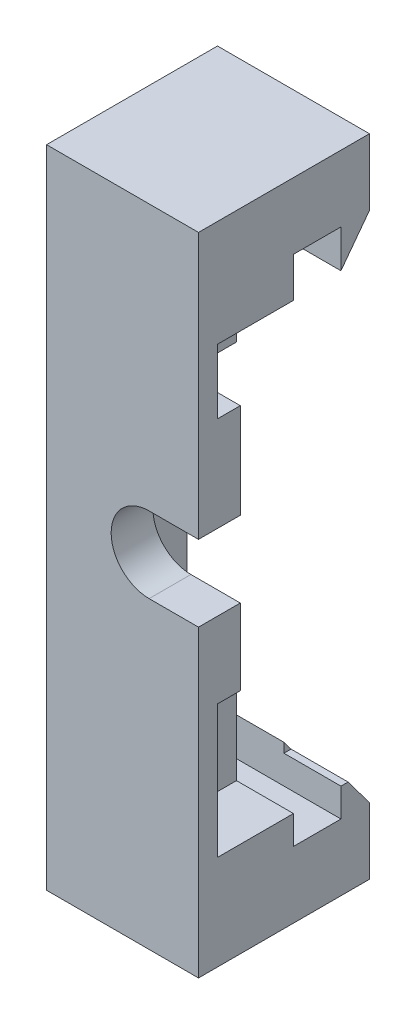
ISO-10303-21;
HEADER;
FILE_DESCRIPTION(('STEP AP214'),'2;1');
FILE_NAME('part.step','',(''),(''),'','','');
FILE_SCHEMA(('AUTOMOTIVE_DESIGN { 1 0 10303 214 1 1 1 1 }'));
ENDSEC;
DATA;
#1=APPLICATION_CONTEXT('core data for automotive mechanical design processes');
#2=APPLICATION_PROTOCOL_DEFINITION('international standard','automotive_design',2000,#1);
#3=PRODUCT_CONTEXT('',#1,'mechanical');
#4=PRODUCT('Part','Part','',(#3));
#5=PRODUCT_RELATED_PRODUCT_CATEGORY('part','',(#4));
#6=PRODUCT_DEFINITION_FORMATION('','',#4);
#7=PRODUCT_DEFINITION_CONTEXT('part definition',#1,'design');
#8=PRODUCT_DEFINITION('design','',#6,#7);
#9=PRODUCT_DEFINITION_SHAPE('','',#8);
#10=(LENGTH_UNIT() NAMED_UNIT(*) SI_UNIT(.MILLI.,.METRE.));
#11=(NAMED_UNIT(*) PLANE_ANGLE_UNIT() SI_UNIT($,.RADIAN.));
#12=(NAMED_UNIT(*) SI_UNIT($,.STERADIAN.) SOLID_ANGLE_UNIT());
#13=UNCERTAINTY_MEASURE_WITH_UNIT(LENGTH_MEASURE(1.E-05),#10,'distance_accuracy_value','');
#14=(GEOMETRIC_REPRESENTATION_CONTEXT(3) GLOBAL_UNCERTAINTY_ASSIGNED_CONTEXT((#13)) GLOBAL_UNIT_ASSIGNED_CONTEXT((#10,
#11,#12)) REPRESENTATION_CONTEXT('',''));
#15=CARTESIAN_POINT('',(0.,0.,0.));
#16=DIRECTION('',(0.,0.,1.));
#17=DIRECTION('',(1.,0.,0.));
#18=AXIS2_PLACEMENT_3D('',#15,#16,#17);
#19=CARTESIAN_POINT('',(4.,0.,6.));
#20=DIRECTION('',(-1.,0.,0.));
#21=DIRECTION('',(0.,0.,1.));
#22=AXIS2_PLACEMENT_3D('',#19,#20,#21);
#23=PLANE('',#22);
#24=DIRECTION('',(0.,0.,-1.));
#25=VECTOR('',#24,1.);
#26=CARTESIAN_POINT('',(4.,8.,13.4));
#27=LINE('',#26,#25);
#28=CARTESIAN_POINT('',(4.,8.,4.5));
#29=VERTEX_POINT('',#28);
#30=CARTESIAN_POINT('',(4.,8.,3.4));
#31=VERTEX_POINT('',#30);
#32=EDGE_CURVE('E569',#29,#31,#27,.T.);
#33=ORIENTED_EDGE('',*,*,#32,.F.);
#34=DIRECTION('',(0.,1.,0.));
#35=VECTOR('',#34,1.);
#36=CARTESIAN_POINT('',(4.,17.,4.5));
#37=LINE('',#36,#35);
#38=CARTESIAN_POINT('',(4.,0.,4.5));
#39=VERTEX_POINT('',#38);
#40=EDGE_CURVE('E232',#39,#29,#37,.T.);
#41=ORIENTED_EDGE('',*,*,#40,.F.);
#42=DIRECTION('',(0.,0.,-1.));
#43=VECTOR('',#42,1.);
#44=CARTESIAN_POINT('',(4.,0.,6.));
#45=LINE('',#44,#43);
#46=CARTESIAN_POINT('',(4.,0.,0.));
#47=VERTEX_POINT('',#46);
#48=EDGE_CURVE('E240',#39,#47,#45,.T.);
#49=ORIENTED_EDGE('',*,*,#48,.T.);
#50=DIRECTION('',(0.,1.,0.));
#51=VECTOR('',#50,1.);
#52=CARTESIAN_POINT('',(4.,0.,0.));
#53=LINE('',#52,#51);
#54=CARTESIAN_POINT('',(4.,1.75,0.));
#55=VERTEX_POINT('',#54);
#56=EDGE_CURVE('E287',#47,#55,#53,.T.);
#57=ORIENTED_EDGE('',*,*,#56,.T.);
#58=DIRECTION('',(0.,0.799999999999999,0.600000000000001));
#59=VECTOR('',#58,1.);
#60=CARTESIAN_POINT('',(4.,1.75,0.));
#61=LINE('',#60,#59);
#62=CARTESIAN_POINT('',(4.,2.5,0.562500000000002));
#63=VERTEX_POINT('',#62);
#64=EDGE_CURVE('E319',#55,#63,#61,.T.);
#65=ORIENTED_EDGE('',*,*,#64,.T.);
#66=DIRECTION('',(0.,0.,1.));
#67=VECTOR('',#66,1.);
#68=CARTESIAN_POINT('',(4.,2.5,0.));
#69=LINE('',#68,#67);
#70=CARTESIAN_POINT('',(4.,2.5,0.750000000000002));
#71=VERTEX_POINT('',#70);
#72=EDGE_CURVE('E276',#63,#71,#69,.T.);
#73=ORIENTED_EDGE('',*,*,#72,.T.);
#74=DIRECTION('',(0.,-1.,0.));
#75=VECTOR('',#74,1.);
#76=CARTESIAN_POINT('',(4.,2.75,0.750000000000002));
#77=LINE('',#76,#75);
#78=CARTESIAN_POINT('',(4.,1.75,0.750000000000002));
#79=VERTEX_POINT('',#78);
#80=EDGE_CURVE('E322',#71,#79,#77,.T.);
#81=ORIENTED_EDGE('',*,*,#80,.T.);
#82=DIRECTION('',(0.,0.,1.));
#83=VECTOR('',#82,1.);
#84=CARTESIAN_POINT('',(4.,1.75,0.750000000000002));
#85=LINE('',#84,#83);
#86=CARTESIAN_POINT('',(4.,1.75,2.));
#87=VERTEX_POINT('',#86);
#88=EDGE_CURVE('E494',#79,#87,#85,.T.);
#89=ORIENTED_EDGE('',*,*,#88,.T.);
#90=DIRECTION('',(0.,1.,0.));
#91=VECTOR('',#90,1.);
#92=CARTESIAN_POINT('',(4.,15.25,2.));
#93=LINE('',#92,#91);
#94=CARTESIAN_POINT('',(4.,2.5,2.));
#95=VERTEX_POINT('',#94);
#96=EDGE_CURVE('E497',#87,#95,#93,.T.);
#97=ORIENTED_EDGE('',*,*,#96,.T.);
#98=CARTESIAN_POINT('',(4.,2.5,4.));
#99=VERTEX_POINT('',#98);
#100=EDGE_CURVE('E272',#95,#99,#69,.T.);
#101=ORIENTED_EDGE('',*,*,#100,.T.);
#102=DIRECTION('',(0.,1.,0.));
#103=VECTOR('',#102,1.);
#104=CARTESIAN_POINT('',(4.,5.25,4.));
#105=LINE('',#104,#103);
#106=CARTESIAN_POINT('',(4.,6.,4.));
#107=VERTEX_POINT('',#106);
#108=EDGE_CURVE('E475',#99,#107,#105,.T.);
#109=ORIENTED_EDGE('',*,*,#108,.T.);
#110=DIRECTION('',(0.,0.,1.));
#111=VECTOR('',#110,1.);
#112=CARTESIAN_POINT('',(4.,6.,6.));
#113=LINE('',#112,#111);
#114=CARTESIAN_POINT('',(4.,6.,3.4));
#115=VERTEX_POINT('',#114);
#116=EDGE_CURVE('E484',#115,#107,#113,.T.);
#117=ORIENTED_EDGE('',*,*,#116,.F.);
#118=DIRECTION('',(0.,-1.,0.));
#119=VECTOR('',#118,1.);
#120=CARTESIAN_POINT('',(4.,12.5,3.4));
#121=LINE('',#120,#119);
#122=EDGE_CURVE('E453',#31,#115,#121,.T.);
#123=ORIENTED_EDGE('',*,*,#122,.F.);
#124=EDGE_LOOP('',(#33,#41,#49,#57,#65,#73,#81,#89,#97,#101,#109,#117,#123));
#125=FACE_BOUND('',#124,.T.);
#126=ADVANCED_FACE('F33',(#125),#23,.F.);
#127=CARTESIAN_POINT('',(4.,6.,0.));
#128=DIRECTION('',(0.,-1.,0.));
#129=DIRECTION('',(1.,0.,0.));
#130=AXIS2_PLACEMENT_3D('',#127,#128,#129);
#131=PLANE('',#130);
#132=DIRECTION('',(-1.,0.,0.));
#133=VECTOR('',#132,1.);
#134=CARTESIAN_POINT('',(11.0007142492749,6.,3.4));
#135=LINE('',#134,#133);
#136=CARTESIAN_POINT('',(2.5,6.,3.4));
#137=VERTEX_POINT('',#136);
#138=CARTESIAN_POINT('',(1.2,6.,3.4));
#139=VERTEX_POINT('',#138);
#140=EDGE_CURVE('E443',#137,#139,#135,.T.);
#141=ORIENTED_EDGE('',*,*,#140,.F.);
#142=DIRECTION('',(0.,0.,-1.));
#143=VECTOR('',#142,1.);
#144=CARTESIAN_POINT('',(2.5,6.,4.));
#145=LINE('',#144,#143);
#146=CARTESIAN_POINT('',(2.5,6.,2.));
#147=VERTEX_POINT('',#146);
#148=EDGE_CURVE('E483',#137,#147,#145,.T.);
#149=ORIENTED_EDGE('',*,*,#148,.T.);
#150=DIRECTION('',(-1.,0.,0.));
#151=VECTOR('',#150,1.);
#152=CARTESIAN_POINT('',(4.,6.,2.));
#153=LINE('',#152,#151);
#154=CARTESIAN_POINT('',(1.2,6.,2.));
#155=VERTEX_POINT('',#154);
#156=EDGE_CURVE('E346',#147,#155,#153,.T.);
#157=ORIENTED_EDGE('',*,*,#156,.T.);
#158=DIRECTION('',(0.,0.,1.));
#159=VECTOR('',#158,1.);
#160=CARTESIAN_POINT('',(1.2,6.,0.));
#161=LINE('',#160,#159);
#162=EDGE_CURVE('E356',#155,#139,#161,.T.);
#163=ORIENTED_EDGE('',*,*,#162,.T.);
#164=EDGE_LOOP('',(#141,#149,#157,#163));
#165=FACE_BOUND('',#164,.T.);
#166=ADVANCED_FACE('F387',(#165),#131,.F.);
#167=CARTESIAN_POINT('',(1.2,12.5,0.));
#168=DIRECTION('',(-1.,0.,0.));
#169=DIRECTION('',(0.,-1.,0.));
#170=AXIS2_PLACEMENT_3D('',#167,#168,#169);
#171=PLANE('',#170);
#172=DIRECTION('',(0.,1.,0.));
#173=VECTOR('',#172,1.);
#174=CARTESIAN_POINT('',(1.2,12.5,3.4));
#175=LINE('',#174,#173);
#176=CARTESIAN_POINT('',(1.2,12.5,3.4));
#177=VERTEX_POINT('',#176);
#178=EDGE_CURVE('E441',#139,#177,#175,.T.);
#179=ORIENTED_EDGE('',*,*,#178,.F.);
#180=ORIENTED_EDGE('',*,*,#162,.F.);
#181=DIRECTION('',(0.,1.,0.));
#182=VECTOR('',#181,1.);
#183=CARTESIAN_POINT('',(1.2,12.5,2.));
#184=LINE('',#183,#182);
#185=CARTESIAN_POINT('',(1.2,12.5,2.));
#186=VERTEX_POINT('',#185);
#187=EDGE_CURVE('E329',#155,#186,#184,.T.);
#188=ORIENTED_EDGE('',*,*,#187,.T.);
#189=DIRECTION('',(0.,0.,1.));
#190=VECTOR('',#189,1.);
#191=CARTESIAN_POINT('',(1.2,12.5,0.));
#192=LINE('',#191,#190);
#193=EDGE_CURVE('E358',#186,#177,#192,.T.);
#194=ORIENTED_EDGE('',*,*,#193,.T.);
#195=EDGE_LOOP('',(#179,#180,#188,#194));
#196=FACE_BOUND('',#195,.T.);
#197=ADVANCED_FACE('F392',(#196),#171,.F.);
#198=CARTESIAN_POINT('',(4.,12.5,0.));
#199=DIRECTION('',(0.,1.,0.));
#200=DIRECTION('',(-1.,0.,0.));
#201=AXIS2_PLACEMENT_3D('',#198,#199,#200);
#202=PLANE('',#201);
#203=DIRECTION('',(-1.,0.,0.));
#204=VECTOR('',#203,1.);
#205=CARTESIAN_POINT('',(11.0007142492749,12.5,3.4));
#206=LINE('',#205,#204);
#207=CARTESIAN_POINT('',(2.5,12.5,3.4));
#208=VERTEX_POINT('',#207);
#209=EDGE_CURVE('E434',#208,#177,#206,.T.);
#210=ORIENTED_EDGE('',*,*,#209,.T.);
#211=ORIENTED_EDGE('',*,*,#193,.F.);
#212=DIRECTION('',(1.,0.,0.));
#213=VECTOR('',#212,1.);
#214=CARTESIAN_POINT('',(4.,12.5,2.));
#215=LINE('',#214,#213);
#216=CARTESIAN_POINT('',(2.5,12.5,2.));
#217=VERTEX_POINT('',#216);
#218=EDGE_CURVE('E246',#186,#217,#215,.T.);
#219=ORIENTED_EDGE('',*,*,#218,.T.);
#220=DIRECTION('',(0.,0.,-1.));
#221=VECTOR('',#220,1.);
#222=CARTESIAN_POINT('',(2.5,12.5,4.));
#223=LINE('',#222,#221);
#224=EDGE_CURVE('E435',#208,#217,#223,.T.);
#225=ORIENTED_EDGE('',*,*,#224,.F.);
#226=EDGE_LOOP('',(#210,#211,#219,#225));
#227=FACE_BOUND('',#226,.T.);
#228=ADVANCED_FACE('F385',(#227),#202,.F.);
#229=CARTESIAN_POINT('',(0.,0.,0.));
#230=DIRECTION('',(0.,0.,-1.));
#231=DIRECTION('',(-1.,0.,0.));
#232=AXIS2_PLACEMENT_3D('',#229,#230,#231);
#233=PLANE('',#232);
#234=DIRECTION('',(-1.,0.,0.));
#235=VECTOR('',#234,1.);
#236=CARTESIAN_POINT('',(4.,15.25,0.));
#237=LINE('',#236,#235);
#238=CARTESIAN_POINT('',(4.,15.25,0.));
#239=VERTEX_POINT('',#238);
#240=CARTESIAN_POINT('',(0.,15.25,0.));
#241=VERTEX_POINT('',#240);
#242=EDGE_CURVE('E311',#239,#241,#237,.T.);
#243=ORIENTED_EDGE('',*,*,#242,.T.);
#244=DIRECTION('',(0.,-1.,0.));
#245=VECTOR('',#244,1.);
#246=CARTESIAN_POINT('',(0.,0.,0.));
#247=LINE('',#246,#245);
#248=CARTESIAN_POINT('',(0.,17.,0.));
#249=VERTEX_POINT('',#248);
#250=EDGE_CURVE('E281',#249,#241,#247,.T.);
#251=ORIENTED_EDGE('',*,*,#250,.F.);
#252=DIRECTION('',(-1.,0.,0.));
#253=VECTOR('',#252,1.);
#254=CARTESIAN_POINT('',(0.,17.,0.));
#255=LINE('',#254,#253);
#256=CARTESIAN_POINT('',(4.,17.,0.));
#257=VERTEX_POINT('',#256);
#258=EDGE_CURVE('E290',#257,#249,#255,.T.);
#259=ORIENTED_EDGE('',*,*,#258,.F.);
#260=EDGE_CURVE('E286',#239,#257,#53,.T.);
#261=ORIENTED_EDGE('',*,*,#260,.F.);
#262=EDGE_LOOP('',(#243,#251,#259,#261));
#263=FACE_BOUND('',#262,.T.);
#264=ADVANCED_FACE('F310',(#263),#233,.T.);
#265=CARTESIAN_POINT('',(4.,2.5,0.));
#266=DIRECTION('',(0.,-1.,0.));
#267=DIRECTION('',(0.,0.,-1.));
#268=AXIS2_PLACEMENT_3D('',#265,#266,#267);
#269=PLANE('',#268);
#270=DIRECTION('',(0.,0.,1.));
#271=VECTOR('',#270,1.);
#272=CARTESIAN_POINT('',(2.5,2.5,0.));
#273=LINE('',#272,#271);
#274=CARTESIAN_POINT('',(2.5,2.5,2.));
#275=VERTEX_POINT('',#274);
#276=CARTESIAN_POINT('',(2.5,2.5,4.));
#277=VERTEX_POINT('',#276);
#278=EDGE_CURVE('E273',#275,#277,#273,.T.);
#279=ORIENTED_EDGE('',*,*,#278,.T.);
#280=DIRECTION('',(1.,0.,0.));
#281=VECTOR('',#280,1.);
#282=CARTESIAN_POINT('',(2.,2.5,4.));
#283=LINE('',#282,#281);
#284=EDGE_CURVE('E488',#277,#99,#283,.T.);
#285=ORIENTED_EDGE('',*,*,#284,.T.);
#286=ORIENTED_EDGE('',*,*,#100,.F.);
#287=DIRECTION('',(-1.,0.,0.));
#288=VECTOR('',#287,1.);
#289=CARTESIAN_POINT('',(4.,2.5,2.));
#290=LINE('',#289,#288);
#291=EDGE_CURVE('E351',#95,#275,#290,.T.);
#292=ORIENTED_EDGE('',*,*,#291,.T.);
#293=EDGE_LOOP('',(#279,#285,#286,#292));
#294=FACE_BOUND('',#293,.T.);
#295=ADVANCED_FACE('F381',(#294),#269,.F.);
#296=CARTESIAN_POINT('',(2.5,5.25,0.));
#297=DIRECTION('',(-1.,0.,0.));
#298=DIRECTION('',(0.,0.,1.));
#299=AXIS2_PLACEMENT_3D('',#296,#297,#298);
#300=PLANE('',#299);
#301=DIRECTION('',(0.,1.,0.));
#302=VECTOR('',#301,1.);
#303=CARTESIAN_POINT('',(2.5,5.25,2.));
#304=LINE('',#303,#302);
#305=EDGE_CURVE('E348',#275,#147,#304,.T.);
#306=ORIENTED_EDGE('',*,*,#305,.T.);
#307=ORIENTED_EDGE('',*,*,#148,.F.);
#308=CARTESIAN_POINT('',(2.5,6.,4.));
#309=VERTEX_POINT('',#308);
#310=EDGE_CURVE('E470',#309,#137,#145,.T.);
#311=ORIENTED_EDGE('',*,*,#310,.F.);
#312=DIRECTION('',(0.,-1.,0.));
#313=VECTOR('',#312,1.);
#314=CARTESIAN_POINT('',(2.5,5.25,4.));
#315=LINE('',#314,#313);
#316=EDGE_CURVE('E490',#309,#277,#315,.T.);
#317=ORIENTED_EDGE('',*,*,#316,.T.);
#318=ORIENTED_EDGE('',*,*,#278,.F.);
#319=EDGE_LOOP('',(#306,#307,#311,#317,#318));
#320=FACE_BOUND('',#319,.T.);
#321=ADVANCED_FACE('F402',(#320),#300,.F.);
#322=CARTESIAN_POINT('',(0.,0.,6.));
#323=DIRECTION('',(1.,0.,0.));
#324=DIRECTION('',(0.,0.,-1.));
#325=AXIS2_PLACEMENT_3D('',#322,#323,#324);
#326=PLANE('',#325);
#327=DIRECTION('',(0.,0.,-1.));
#328=VECTOR('',#327,1.);
#329=CARTESIAN_POINT('',(0.,0.,6.));
#330=LINE('',#329,#328);
#331=CARTESIAN_POINT('',(0.,0.,4.5));
#332=VERTEX_POINT('',#331);
#333=CARTESIAN_POINT('',(0.,0.,0.));
#334=VERTEX_POINT('',#333);
#335=EDGE_CURVE('E238',#332,#334,#330,.T.);
#336=ORIENTED_EDGE('',*,*,#335,.F.);
#337=DIRECTION('',(0.,1.,0.));
#338=VECTOR('',#337,1.);
#339=CARTESIAN_POINT('',(0.,17.,4.5));
#340=LINE('',#339,#338);
#341=CARTESIAN_POINT('',(0.,17.,4.5));
#342=VERTEX_POINT('',#341);
#343=EDGE_CURVE('E222',#332,#342,#340,.T.);
#344=ORIENTED_EDGE('',*,*,#343,.T.);
#345=DIRECTION('',(0.,0.,-1.));
#346=VECTOR('',#345,1.);
#347=CARTESIAN_POINT('',(0.,17.,6.));
#348=LINE('',#347,#346);
#349=EDGE_CURVE('E293',#342,#249,#348,.T.);
#350=ORIENTED_EDGE('',*,*,#349,.T.);
#351=ORIENTED_EDGE('',*,*,#250,.T.);
#352=DIRECTION('',(0.,0.799999999999999,-0.600000000000001));
#353=VECTOR('',#352,1.);
#354=CARTESIAN_POINT('',(0.,15.25,0.));
#355=LINE('',#354,#353);
#356=CARTESIAN_POINT('',(0.,14.25,0.750000000000002));
#357=VERTEX_POINT('',#356);
#358=EDGE_CURVE('E314',#357,#241,#355,.T.);
#359=ORIENTED_EDGE('',*,*,#358,.F.);
#360=DIRECTION('',(0.,-1.,0.));
#361=VECTOR('',#360,1.);
#362=CARTESIAN_POINT('',(0.,14.25,0.750000000000002));
#363=LINE('',#362,#361);
#364=CARTESIAN_POINT('',(0.,15.25,0.750000000000002));
#365=VERTEX_POINT('',#364);
#366=EDGE_CURVE('E317',#365,#357,#363,.T.);
#367=ORIENTED_EDGE('',*,*,#366,.F.);
#368=DIRECTION('',(0.,0.,-1.));
#369=VECTOR('',#368,1.);
#370=CARTESIAN_POINT('',(0.,15.25,0.750000000000002));
#371=LINE('',#370,#369);
#372=CARTESIAN_POINT('',(0.,15.25,2.));
#373=VERTEX_POINT('',#372);
#374=EDGE_CURVE('E324',#373,#365,#371,.T.);
#375=ORIENTED_EDGE('',*,*,#374,.F.);
#376=DIRECTION('',(0.,1.,0.));
#377=VECTOR('',#376,1.);
#378=CARTESIAN_POINT('',(0.,15.25,2.));
#379=LINE('',#378,#377);
#380=CARTESIAN_POINT('',(0.,1.75,2.));
#381=VERTEX_POINT('',#380);
#382=EDGE_CURVE('E513',#381,#373,#379,.T.);
#383=ORIENTED_EDGE('',*,*,#382,.F.);
#384=DIRECTION('',(0.,0.,1.));
#385=VECTOR('',#384,1.);
#386=CARTESIAN_POINT('',(0.,1.75,0.750000000000002));
#387=LINE('',#386,#385);
#388=CARTESIAN_POINT('',(0.,1.75,0.750000000000002));
#389=VERTEX_POINT('',#388);
#390=EDGE_CURVE('E510',#389,#381,#387,.T.);
#391=ORIENTED_EDGE('',*,*,#390,.F.);
#392=DIRECTION('',(0.,-1.,0.));
#393=VECTOR('',#392,1.);
#394=CARTESIAN_POINT('',(0.,2.75,0.750000000000002));
#395=LINE('',#394,#393);
#396=CARTESIAN_POINT('',(0.,2.75,0.750000000000002));
#397=VERTEX_POINT('',#396);
#398=EDGE_CURVE('E507',#397,#389,#395,.T.);
#399=ORIENTED_EDGE('',*,*,#398,.F.);
#400=DIRECTION('',(0.,0.799999999999999,0.600000000000001));
#401=VECTOR('',#400,1.);
#402=CARTESIAN_POINT('',(0.,1.75,0.));
#403=LINE('',#402,#401);
#404=CARTESIAN_POINT('',(0.,1.75,0.));
#405=VERTEX_POINT('',#404);
#406=EDGE_CURVE('E491',#405,#397,#403,.T.);
#407=ORIENTED_EDGE('',*,*,#406,.F.);
#408=EDGE_CURVE('E244',#405,#334,#247,.T.);
#409=ORIENTED_EDGE('',*,*,#408,.T.);
#410=EDGE_LOOP('',(#336,#344,#350,#351,#359,#367,#375,#383,#391,#399,#407,#409));
#411=FACE_BOUND('',#410,.T.);
#412=ADVANCED_FACE('F35',(#411),#326,.F.);
#413=CARTESIAN_POINT('',(0.,0.,6.));
#414=DIRECTION('',(0.,1.,0.));
#415=DIRECTION('',(0.,0.,1.));
#416=AXIS2_PLACEMENT_3D('',#413,#414,#415);
#417=PLANE('',#416);
#418=ORIENTED_EDGE('',*,*,#48,.F.);
#419=DIRECTION('',(1.,0.,0.));
#420=VECTOR('',#419,1.);
#421=CARTESIAN_POINT('',(0.,0.,4.5));
#422=LINE('',#421,#420);
#423=EDGE_CURVE('E225',#332,#39,#422,.T.);
#424=ORIENTED_EDGE('',*,*,#423,.F.);
#425=ORIENTED_EDGE('',*,*,#335,.T.);
#426=DIRECTION('',(1.,0.,0.));
#427=VECTOR('',#426,1.);
#428=CARTESIAN_POINT('',(0.,0.,0.));
#429=LINE('',#428,#427);
#430=EDGE_CURVE('E284',#334,#47,#429,.T.);
#431=ORIENTED_EDGE('',*,*,#430,.T.);
#432=EDGE_LOOP('',(#418,#424,#425,#431));
#433=FACE_BOUND('',#432,.T.);
#434=ADVANCED_FACE('F236',(#433),#417,.F.);
#435=DIRECTION('',(0.,0.,-1.));
#436=VECTOR('',#435,1.);
#437=CARTESIAN_POINT('',(4.,17.,6.));
#438=LINE('',#437,#436);
#439=CARTESIAN_POINT('',(4.,17.,4.5));
#440=VERTEX_POINT('',#439);
#441=EDGE_CURVE('E251',#440,#257,#438,.T.);
#442=ORIENTED_EDGE('',*,*,#441,.F.);
#443=CARTESIAN_POINT('',(4.,10.,4.5));
#444=VERTEX_POINT('',#443);
#445=EDGE_CURVE('E582',#444,#440,#37,.T.);
#446=ORIENTED_EDGE('',*,*,#445,.F.);
#447=DIRECTION('',(0.,0.,-1.));
#448=VECTOR('',#447,1.);
#449=CARTESIAN_POINT('',(4.,10.,13.4));
#450=LINE('',#449,#448);
#451=CARTESIAN_POINT('',(4.,10.,3.4));
#452=VERTEX_POINT('',#451);
#453=EDGE_CURVE('E566',#444,#452,#450,.T.);
#454=ORIENTED_EDGE('',*,*,#453,.T.);
#455=CARTESIAN_POINT('',(4.,12.5,3.4));
#456=VERTEX_POINT('',#455);
#457=EDGE_CURVE('E541',#456,#452,#121,.T.);
#458=ORIENTED_EDGE('',*,*,#457,.F.);
#459=DIRECTION('',(0.,0.,-1.));
#460=VECTOR('',#459,1.);
#461=CARTESIAN_POINT('',(4.,12.5,6.));
#462=LINE('',#461,#460);
#463=CARTESIAN_POINT('',(4.,12.5,4.));
#464=VERTEX_POINT('',#463);
#465=EDGE_CURVE('E451',#464,#456,#462,.T.);
#466=ORIENTED_EDGE('',*,*,#465,.F.);
#467=DIRECTION('',(0.,-1.,0.));
#468=VECTOR('',#467,1.);
#469=CARTESIAN_POINT('',(4.,12.5,4.));
#470=LINE('',#469,#468);
#471=CARTESIAN_POINT('',(4.,14.2,4.));
#472=VERTEX_POINT('',#471);
#473=EDGE_CURVE('E454',#472,#464,#470,.T.);
#474=ORIENTED_EDGE('',*,*,#473,.F.);
#475=DIRECTION('',(0.,0.,-1.));
#476=VECTOR('',#475,1.);
#477=CARTESIAN_POINT('',(4.,14.2,4.));
#478=LINE('',#477,#476);
#479=CARTESIAN_POINT('',(4.,14.2,2.));
#480=VERTEX_POINT('',#479);
#481=EDGE_CURVE('E472',#472,#480,#478,.T.);
#482=ORIENTED_EDGE('',*,*,#481,.T.);
#483=CARTESIAN_POINT('',(4.,15.25,2.));
#484=VERTEX_POINT('',#483);
#485=EDGE_CURVE('E496',#480,#484,#93,.T.);
#486=ORIENTED_EDGE('',*,*,#485,.T.);
#487=DIRECTION('',(0.,0.,-1.));
#488=VECTOR('',#487,1.);
#489=CARTESIAN_POINT('',(4.,15.25,0.750000000000002));
#490=LINE('',#489,#488);
#491=CARTESIAN_POINT('',(4.,15.25,0.750000000000002));
#492=VERTEX_POINT('',#491);
#493=EDGE_CURVE('E500',#484,#492,#490,.T.);
#494=ORIENTED_EDGE('',*,*,#493,.T.);
#495=DIRECTION('',(0.,-1.,0.));
#496=VECTOR('',#495,1.);
#497=CARTESIAN_POINT('',(4.,14.25,0.750000000000002));
#498=LINE('',#497,#496);
#499=CARTESIAN_POINT('',(4.,14.25,0.750000000000002));
#500=VERTEX_POINT('',#499);
#501=EDGE_CURVE('E503',#492,#500,#498,.T.);
#502=ORIENTED_EDGE('',*,*,#501,.T.);
#503=DIRECTION('',(0.,0.799999999999999,-0.600000000000001));
#504=VECTOR('',#503,1.);
#505=CARTESIAN_POINT('',(4.,15.25,0.));
#506=LINE('',#505,#504);
#507=EDGE_CURVE('E307',#500,#239,#506,.T.);
#508=ORIENTED_EDGE('',*,*,#507,.T.);
#509=ORIENTED_EDGE('',*,*,#260,.T.);
#510=EDGE_LOOP('',(#442,#446,#454,#458,#466,#474,#482,#486,#494,#502,#508,#509));
#511=FACE_BOUND('',#510,.T.);
#512=ADVANCED_FACE('F304',(#511),#23,.F.);
#513=CARTESIAN_POINT('',(0.,17.,6.));
#514=DIRECTION('',(0.,-1.,0.));
#515=DIRECTION('',(0.,0.,-1.));
#516=AXIS2_PLACEMENT_3D('',#513,#514,#515);
#517=PLANE('',#516);
#518=ORIENTED_EDGE('',*,*,#349,.F.);
#519=DIRECTION('',(1.,0.,0.));
#520=VECTOR('',#519,1.);
#521=CARTESIAN_POINT('',(0.,17.,4.5));
#522=LINE('',#521,#520);
#523=EDGE_CURVE('E228',#342,#440,#522,.T.);
#524=ORIENTED_EDGE('',*,*,#523,.T.);
#525=ORIENTED_EDGE('',*,*,#441,.T.);
#526=ORIENTED_EDGE('',*,*,#258,.T.);
#527=EDGE_LOOP('',(#518,#524,#525,#526));
#528=FACE_BOUND('',#527,.T.);
#529=ADVANCED_FACE('F297',(#528),#517,.F.);
#530=DIRECTION('',(-1.,0.,0.));
#531=VECTOR('',#530,1.);
#532=CARTESIAN_POINT('',(4.,1.75,0.));
#533=LINE('',#532,#531);
#534=EDGE_CURVE('E342',#55,#405,#533,.T.);
#535=ORIENTED_EDGE('',*,*,#534,.F.);
#536=ORIENTED_EDGE('',*,*,#56,.F.);
#537=ORIENTED_EDGE('',*,*,#430,.F.);
#538=ORIENTED_EDGE('',*,*,#408,.F.);
#539=EDGE_LOOP('',(#535,#536,#537,#538));
#540=FACE_BOUND('',#539,.T.);
#541=ADVANCED_FACE('F373',(#540),#233,.T.);
#542=CARTESIAN_POINT('',(2.5,2.5,0.562500000000002));
#543=VERTEX_POINT('',#542);
#544=CARTESIAN_POINT('',(2.5,2.5,0.750000000000002));
#545=VERTEX_POINT('',#544);
#546=EDGE_CURVE('E261',#543,#545,#273,.T.);
#547=ORIENTED_EDGE('',*,*,#546,.T.);
#548=DIRECTION('',(1.,0.,0.));
#549=VECTOR('',#548,1.);
#550=CARTESIAN_POINT('',(4.,2.5,0.750000000000002));
#551=LINE('',#550,#549);
#552=EDGE_CURVE('E269',#545,#71,#551,.T.);
#553=ORIENTED_EDGE('',*,*,#552,.T.);
#554=ORIENTED_EDGE('',*,*,#72,.F.);
#555=DIRECTION('',(-1.,0.,0.));
#556=VECTOR('',#555,1.);
#557=CARTESIAN_POINT('',(4.,2.5,0.562500000000002));
#558=LINE('',#557,#556);
#559=EDGE_CURVE('E271',#63,#543,#558,.T.);
#560=ORIENTED_EDGE('',*,*,#559,.T.);
#561=EDGE_LOOP('',(#547,#553,#554,#560));
#562=FACE_BOUND('',#561,.T.);
#563=ADVANCED_FACE('F267',(#562),#269,.F.);
#564=DIRECTION('',(0.,0.799999999999999,0.600000000000001));
#565=VECTOR('',#564,1.);
#566=CARTESIAN_POINT('',(2.5,3.98999999999999,1.68));
#567=LINE('',#566,#565);
#568=CARTESIAN_POINT('',(2.5,2.75,0.750000000000002));
#569=VERTEX_POINT('',#568);
#570=EDGE_CURVE('E249',#543,#569,#567,.T.);
#571=ORIENTED_EDGE('',*,*,#570,.T.);
#572=DIRECTION('',(0.,-1.,0.));
#573=VECTOR('',#572,1.);
#574=CARTESIAN_POINT('',(2.5,5.25,0.750000000000002));
#575=LINE('',#574,#573);
#576=EDGE_CURVE('E41',#569,#545,#575,.T.);
#577=ORIENTED_EDGE('',*,*,#576,.T.);
#578=ORIENTED_EDGE('',*,*,#546,.F.);
#579=EDGE_LOOP('',(#571,#577,#578));
#580=FACE_BOUND('',#579,.T.);
#581=ADVANCED_FACE('F260',(#580),#300,.F.);
#582=CARTESIAN_POINT('',(4.,2.75,0.750000000000002));
#583=DIRECTION('',(0.,0.,-1.));
#584=DIRECTION('',(-1.,0.,0.));
#585=AXIS2_PLACEMENT_3D('',#582,#583,#584);
#586=PLANE('',#585);
#587=ORIENTED_EDGE('',*,*,#576,.F.);
#588=DIRECTION('',(-1.,0.,0.));
#589=VECTOR('',#588,1.);
#590=CARTESIAN_POINT('',(4.,2.75,0.750000000000002));
#591=LINE('',#590,#589);
#592=EDGE_CURVE('E340',#569,#397,#591,.T.);
#593=ORIENTED_EDGE('',*,*,#592,.T.);
#594=ORIENTED_EDGE('',*,*,#398,.T.);
#595=DIRECTION('',(-1.,0.,0.));
#596=VECTOR('',#595,1.);
#597=CARTESIAN_POINT('',(4.,1.75,0.750000000000002));
#598=LINE('',#597,#596);
#599=EDGE_CURVE('E338',#79,#389,#598,.T.);
#600=ORIENTED_EDGE('',*,*,#599,.F.);
#601=ORIENTED_EDGE('',*,*,#80,.F.);
#602=ORIENTED_EDGE('',*,*,#552,.F.);
#603=EDGE_LOOP('',(#587,#593,#594,#600,#601,#602));
#604=FACE_BOUND('',#603,.T.);
#605=ADVANCED_FACE('F412',(#604),#586,.F.);
#606=CARTESIAN_POINT('',(4.,1.75,0.));
#607=DIRECTION('',(0.,-0.600000000000001,0.799999999999999));
#608=DIRECTION('',(0.,-0.799999999999999,-0.600000000000001));
#609=AXIS2_PLACEMENT_3D('',#606,#607,#608);
#610=PLANE('',#609);
#611=ORIENTED_EDGE('',*,*,#64,.F.);
#612=ORIENTED_EDGE('',*,*,#534,.T.);
#613=ORIENTED_EDGE('',*,*,#406,.T.);
#614=ORIENTED_EDGE('',*,*,#592,.F.);
#615=ORIENTED_EDGE('',*,*,#570,.F.);
#616=ORIENTED_EDGE('',*,*,#559,.F.);
#617=EDGE_LOOP('',(#611,#612,#613,#614,#615,#616));
#618=FACE_BOUND('',#617,.T.);
#619=ADVANCED_FACE('F370',(#618),#610,.F.);
#620=CARTESIAN_POINT('',(4.,15.25,2.));
#621=DIRECTION('',(0.,0.,1.));
#622=DIRECTION('',(1.,0.,0.));
#623=AXIS2_PLACEMENT_3D('',#620,#621,#622);
#624=PLANE('',#623);
#625=ORIENTED_EDGE('',*,*,#485,.F.);
#626=DIRECTION('',(1.,0.,0.));
#627=VECTOR('',#626,1.);
#628=CARTESIAN_POINT('',(4.,14.2,2.));
#629=LINE('',#628,#627);
#630=CARTESIAN_POINT('',(2.5,14.2,2.));
#631=VERTEX_POINT('',#630);
#632=EDGE_CURVE('E458',#631,#480,#629,.T.);
#633=ORIENTED_EDGE('',*,*,#632,.F.);
#634=DIRECTION('',(0.,1.,0.));
#635=VECTOR('',#634,1.);
#636=CARTESIAN_POINT('',(2.5,12.5,2.));
#637=LINE('',#636,#635);
#638=EDGE_CURVE('E467',#217,#631,#637,.T.);
#639=ORIENTED_EDGE('',*,*,#638,.F.);
#640=ORIENTED_EDGE('',*,*,#218,.F.);
#641=ORIENTED_EDGE('',*,*,#187,.F.);
#642=ORIENTED_EDGE('',*,*,#156,.F.);
#643=ORIENTED_EDGE('',*,*,#305,.F.);
#644=ORIENTED_EDGE('',*,*,#291,.F.);
#645=ORIENTED_EDGE('',*,*,#96,.F.);
#646=DIRECTION('',(-1.,0.,0.));
#647=VECTOR('',#646,1.);
#648=CARTESIAN_POINT('',(4.,1.75,2.));
#649=LINE('',#648,#647);
#650=EDGE_CURVE('E336',#87,#381,#649,.T.);
#651=ORIENTED_EDGE('',*,*,#650,.T.);
#652=ORIENTED_EDGE('',*,*,#382,.T.);
#653=DIRECTION('',(-1.,0.,0.));
#654=VECTOR('',#653,1.);
#655=CARTESIAN_POINT('',(4.,15.25,2.));
#656=LINE('',#655,#654);
#657=EDGE_CURVE('E334',#484,#373,#656,.T.);
#658=ORIENTED_EDGE('',*,*,#657,.F.);
#659=EDGE_LOOP('',(#625,#633,#639,#640,#641,#642,#643,#644,#645,#651,#652,#658));
#660=FACE_BOUND('',#659,.T.);
#661=ADVANCED_FACE('F420',(#660),#624,.F.);
#662=CARTESIAN_POINT('',(4.,15.25,0.));
#663=DIRECTION('',(0.,0.600000000000001,0.799999999999999));
#664=DIRECTION('',(0.,-0.799999999999999,0.600000000000001));
#665=AXIS2_PLACEMENT_3D('',#662,#663,#664);
#666=PLANE('',#665);
#667=ORIENTED_EDGE('',*,*,#358,.T.);
#668=ORIENTED_EDGE('',*,*,#242,.F.);
#669=ORIENTED_EDGE('',*,*,#507,.F.);
#670=DIRECTION('',(-1.,0.,0.));
#671=VECTOR('',#670,1.);
#672=CARTESIAN_POINT('',(4.,14.25,0.750000000000002));
#673=LINE('',#672,#671);
#674=EDGE_CURVE('E330',#500,#357,#673,.T.);
#675=ORIENTED_EDGE('',*,*,#674,.T.);
#676=EDGE_LOOP('',(#667,#668,#669,#675));
#677=FACE_BOUND('',#676,.T.);
#678=ADVANCED_FACE('F618',(#677),#666,.F.);
#679=CARTESIAN_POINT('',(4.,14.25,0.750000000000002));
#680=DIRECTION('',(0.,0.,-1.));
#681=DIRECTION('',(-1.,0.,0.));
#682=AXIS2_PLACEMENT_3D('',#679,#680,#681);
#683=PLANE('',#682);
#684=ORIENTED_EDGE('',*,*,#366,.T.);
#685=ORIENTED_EDGE('',*,*,#674,.F.);
#686=ORIENTED_EDGE('',*,*,#501,.F.);
#687=DIRECTION('',(-1.,0.,0.));
#688=VECTOR('',#687,1.);
#689=CARTESIAN_POINT('',(4.,15.25,0.750000000000002));
#690=LINE('',#689,#688);
#691=EDGE_CURVE('E332',#492,#365,#690,.T.);
#692=ORIENTED_EDGE('',*,*,#691,.T.);
#693=EDGE_LOOP('',(#684,#685,#686,#692));
#694=FACE_BOUND('',#693,.T.);
#695=ADVANCED_FACE('F621',(#694),#683,.F.);
#696=CARTESIAN_POINT('',(4.,15.25,0.750000000000002));
#697=DIRECTION('',(0.,1.,0.));
#698=DIRECTION('',(0.,0.,1.));
#699=AXIS2_PLACEMENT_3D('',#696,#697,#698);
#700=PLANE('',#699);
#701=ORIENTED_EDGE('',*,*,#374,.T.);
#702=ORIENTED_EDGE('',*,*,#691,.F.);
#703=ORIENTED_EDGE('',*,*,#493,.F.);
#704=ORIENTED_EDGE('',*,*,#657,.T.);
#705=EDGE_LOOP('',(#701,#702,#703,#704));
#706=FACE_BOUND('',#705,.T.);
#707=ADVANCED_FACE('F517',(#706),#700,.F.);
#708=CARTESIAN_POINT('',(4.,1.75,0.750000000000002));
#709=DIRECTION('',(0.,-1.,0.));
#710=DIRECTION('',(0.,0.,-1.));
#711=AXIS2_PLACEMENT_3D('',#708,#709,#710);
#712=PLANE('',#711);
#713=ORIENTED_EDGE('',*,*,#390,.T.);
#714=ORIENTED_EDGE('',*,*,#650,.F.);
#715=ORIENTED_EDGE('',*,*,#88,.F.);
#716=ORIENTED_EDGE('',*,*,#599,.T.);
#717=EDGE_LOOP('',(#713,#714,#715,#716));
#718=FACE_BOUND('',#717,.T.);
#719=ADVANCED_FACE('F423',(#718),#712,.F.);
#720=CARTESIAN_POINT('',(2.,5.25,4.));
#721=DIRECTION('',(0.,0.,-1.));
#722=DIRECTION('',(-1.,0.,0.));
#723=AXIS2_PLACEMENT_3D('',#720,#721,#722);
#724=PLANE('',#723);
#725=ORIENTED_EDGE('',*,*,#316,.F.);
#726=DIRECTION('',(1.,0.,0.));
#727=VECTOR('',#726,1.);
#728=CARTESIAN_POINT('',(2.5,6.,4.));
#729=LINE('',#728,#727);
#730=EDGE_CURVE('E480',#309,#107,#729,.T.);
#731=ORIENTED_EDGE('',*,*,#730,.T.);
#732=ORIENTED_EDGE('',*,*,#108,.F.);
#733=ORIENTED_EDGE('',*,*,#284,.F.);
#734=EDGE_LOOP('',(#725,#731,#732,#733));
#735=FACE_BOUND('',#734,.T.);
#736=ADVANCED_FACE('F535',(#735),#724,.T.);
#737=CARTESIAN_POINT('',(4.,14.2,4.));
#738=DIRECTION('',(0.,1.,0.));
#739=DIRECTION('',(0.,0.,1.));
#740=AXIS2_PLACEMENT_3D('',#737,#738,#739);
#741=PLANE('',#740);
#742=ORIENTED_EDGE('',*,*,#632,.T.);
#743=ORIENTED_EDGE('',*,*,#481,.F.);
#744=DIRECTION('',(1.,0.,0.));
#745=VECTOR('',#744,1.);
#746=CARTESIAN_POINT('',(4.,14.2,4.));
#747=LINE('',#746,#745);
#748=CARTESIAN_POINT('',(2.5,14.2,4.));
#749=VERTEX_POINT('',#748);
#750=EDGE_CURVE('E464',#749,#472,#747,.T.);
#751=ORIENTED_EDGE('',*,*,#750,.F.);
#752=DIRECTION('',(0.,0.,-1.));
#753=VECTOR('',#752,1.);
#754=CARTESIAN_POINT('',(2.5,14.2,4.));
#755=LINE('',#754,#753);
#756=EDGE_CURVE('E476',#749,#631,#755,.T.);
#757=ORIENTED_EDGE('',*,*,#756,.T.);
#758=EDGE_LOOP('',(#742,#743,#751,#757));
#759=FACE_BOUND('',#758,.T.);
#760=ADVANCED_FACE('F610',(#759),#741,.F.);
#761=CARTESIAN_POINT('',(2.5,12.5,4.));
#762=DIRECTION('',(-1.,0.,0.));
#763=DIRECTION('',(0.,0.,1.));
#764=AXIS2_PLACEMENT_3D('',#761,#762,#763);
#765=PLANE('',#764);
#766=ORIENTED_EDGE('',*,*,#638,.T.);
#767=ORIENTED_EDGE('',*,*,#756,.F.);
#768=DIRECTION('',(0.,1.,0.));
#769=VECTOR('',#768,1.);
#770=CARTESIAN_POINT('',(2.5,12.5,4.));
#771=LINE('',#770,#769);
#772=CARTESIAN_POINT('',(2.5,12.5,4.));
#773=VERTEX_POINT('',#772);
#774=EDGE_CURVE('E461',#773,#749,#771,.T.);
#775=ORIENTED_EDGE('',*,*,#774,.F.);
#776=EDGE_CURVE('E478',#773,#208,#223,.T.);
#777=ORIENTED_EDGE('',*,*,#776,.T.);
#778=ORIENTED_EDGE('',*,*,#224,.T.);
#779=EDGE_LOOP('',(#766,#767,#775,#777,#778));
#780=FACE_BOUND('',#779,.T.);
#781=ADVANCED_FACE('F554',(#780),#765,.F.);
#782=CARTESIAN_POINT('',(0.,0.,4.));
#783=DIRECTION('',(0.,0.,1.));
#784=DIRECTION('',(1.,0.,0.));
#785=AXIS2_PLACEMENT_3D('',#782,#783,#784);
#786=PLANE('',#785);
#787=ORIENTED_EDGE('',*,*,#473,.T.);
#788=DIRECTION('',(-1.,0.,0.));
#789=VECTOR('',#788,1.);
#790=CARTESIAN_POINT('',(4.,12.5,4.));
#791=LINE('',#790,#789);
#792=EDGE_CURVE('E457',#464,#773,#791,.T.);
#793=ORIENTED_EDGE('',*,*,#792,.T.);
#794=ORIENTED_EDGE('',*,*,#774,.T.);
#795=ORIENTED_EDGE('',*,*,#750,.T.);
#796=EDGE_LOOP('',(#787,#793,#794,#795));
#797=FACE_BOUND('',#796,.T.);
#798=ADVANCED_FACE('F606',(#797),#786,.F.);
#799=CARTESIAN_POINT('',(11.0007142492749,6.,6.));
#800=DIRECTION('',(0.,1.,0.));
#801=DIRECTION('',(-1.,0.,0.));
#802=AXIS2_PLACEMENT_3D('',#799,#800,#801);
#803=PLANE('',#802);
#804=ORIENTED_EDGE('',*,*,#730,.F.);
#805=ORIENTED_EDGE('',*,*,#310,.T.);
#806=EDGE_CURVE('E448',#115,#137,#135,.T.);
#807=ORIENTED_EDGE('',*,*,#806,.F.);
#808=ORIENTED_EDGE('',*,*,#116,.T.);
#809=EDGE_LOOP('',(#804,#805,#807,#808));
#810=FACE_BOUND('',#809,.T.);
#811=ADVANCED_FACE('F542',(#810),#803,.F.);
#812=CARTESIAN_POINT('',(11.0007142492749,12.5,6.));
#813=DIRECTION('',(0.,-1.,0.));
#814=DIRECTION('',(1.,0.,0.));
#815=AXIS2_PLACEMENT_3D('',#812,#813,#814);
#816=PLANE('',#815);
#817=EDGE_CURVE('E440',#456,#208,#206,.T.);
#818=ORIENTED_EDGE('',*,*,#817,.T.);
#819=ORIENTED_EDGE('',*,*,#776,.F.);
#820=ORIENTED_EDGE('',*,*,#792,.F.);
#821=ORIENTED_EDGE('',*,*,#465,.T.);
#822=EDGE_LOOP('',(#818,#819,#820,#821));
#823=FACE_BOUND('',#822,.T.);
#824=ADVANCED_FACE('F557',(#823),#816,.F.);
#825=CARTESIAN_POINT('',(11.0007142492749,12.5,3.4));
#826=DIRECTION('',(0.,0.,1.));
#827=DIRECTION('',(0.,-1.,0.));
#828=AXIS2_PLACEMENT_3D('',#825,#826,#827);
#829=PLANE('',#828);
#830=CARTESIAN_POINT('',(2.7,9.,3.4));
#831=DIRECTION('',(0.,0.,-1.));
#832=DIRECTION('',(0.,-1.,0.));
#833=AXIS2_PLACEMENT_3D('',#830,#831,#832);
#834=CIRCLE('',#833,1.);
#835=CARTESIAN_POINT('',(2.7,8.,3.4));
#836=VERTEX_POINT('',#835);
#837=CARTESIAN_POINT('',(2.7,10.,3.4));
#838=VERTEX_POINT('',#837);
#839=EDGE_CURVE('E575',#836,#838,#834,.T.);
#840=ORIENTED_EDGE('',*,*,#839,.F.);
#841=DIRECTION('',(-1.,0.,0.));
#842=VECTOR('',#841,1.);
#843=CARTESIAN_POINT('',(4.,8.,3.4));
#844=LINE('',#843,#842);
#845=EDGE_CURVE('E567',#31,#836,#844,.T.);
#846=ORIENTED_EDGE('',*,*,#845,.F.);
#847=ORIENTED_EDGE('',*,*,#122,.T.);
#848=ORIENTED_EDGE('',*,*,#806,.T.);
#849=ORIENTED_EDGE('',*,*,#140,.T.);
#850=ORIENTED_EDGE('',*,*,#178,.T.);
#851=ORIENTED_EDGE('',*,*,#209,.F.);
#852=ORIENTED_EDGE('',*,*,#817,.F.);
#853=ORIENTED_EDGE('',*,*,#457,.T.);
#854=DIRECTION('',(1.,0.,0.));
#855=VECTOR('',#854,1.);
#856=CARTESIAN_POINT('',(2.7,10.,3.4));
#857=LINE('',#856,#855);
#858=EDGE_CURVE('E562',#838,#452,#857,.T.);
#859=ORIENTED_EDGE('',*,*,#858,.F.);
#860=EDGE_LOOP('',(#840,#846,#847,#848,#849,#850,#851,#852,#853,#859));
#861=FACE_BOUND('',#860,.T.);
#862=ADVANCED_FACE('F545',(#861),#829,.F.);
#863=CARTESIAN_POINT('',(2.7,9.,13.4));
#864=DIRECTION('',(0.,0.,-1.));
#865=DIRECTION('',(0.,1.,0.));
#866=AXIS2_PLACEMENT_3D('',#863,#864,#865);
#867=CYLINDRICAL_SURFACE('',#866,1.);
#868=DIRECTION('',(0.,0.,-1.));
#869=VECTOR('',#868,1.);
#870=CARTESIAN_POINT('',(2.7,10.,13.4));
#871=LINE('',#870,#869);
#872=CARTESIAN_POINT('',(2.7,10.,4.5));
#873=VERTEX_POINT('',#872);
#874=EDGE_CURVE('E54',#873,#838,#871,.T.);
#875=ORIENTED_EDGE('',*,*,#874,.F.);
#876=CARTESIAN_POINT('',(2.7,9.,4.5));
#877=DIRECTION('',(0.,0.,-1.));
#878=DIRECTION('',(0.,1.,0.));
#879=AXIS2_PLACEMENT_3D('',#876,#877,#878);
#880=CIRCLE('',#879,1.);
#881=CARTESIAN_POINT('',(2.7,8.,4.5));
#882=VERTEX_POINT('',#881);
#883=EDGE_CURVE('E48',#873,#882,#880,.F.);
#884=ORIENTED_EDGE('',*,*,#883,.T.);
#885=DIRECTION('',(0.,0.,-1.));
#886=VECTOR('',#885,1.);
#887=CARTESIAN_POINT('',(2.7,8.,13.4));
#888=LINE('',#887,#886);
#889=EDGE_CURVE('E444',#882,#836,#888,.T.);
#890=ORIENTED_EDGE('',*,*,#889,.T.);
#891=ORIENTED_EDGE('',*,*,#839,.T.);
#892=EDGE_LOOP('',(#875,#884,#890,#891));
#893=FACE_BOUND('',#892,.T.);
#894=ADVANCED_FACE('F586',(#893),#867,.F.);
#895=CARTESIAN_POINT('',(4.,8.,13.4));
#896=DIRECTION('',(0.,-1.,0.));
#897=DIRECTION('',(0.,0.,-1.));
#898=AXIS2_PLACEMENT_3D('',#895,#896,#897);
#899=PLANE('',#898);
#900=ORIENTED_EDGE('',*,*,#889,.F.);
#901=DIRECTION('',(1.,0.,0.));
#902=VECTOR('',#901,1.);
#903=CARTESIAN_POINT('',(4.,8.,4.5));
#904=LINE('',#903,#902);
#905=EDGE_CURVE('E577',#882,#29,#904,.T.);
#906=ORIENTED_EDGE('',*,*,#905,.T.);
#907=ORIENTED_EDGE('',*,*,#32,.T.);
#908=ORIENTED_EDGE('',*,*,#845,.T.);
#909=EDGE_LOOP('',(#900,#906,#907,#908));
#910=FACE_BOUND('',#909,.T.);
#911=ADVANCED_FACE('F589',(#910),#899,.F.);
#912=CARTESIAN_POINT('',(2.7,10.,13.4));
#913=DIRECTION('',(0.,1.,0.));
#914=DIRECTION('',(0.,0.,1.));
#915=AXIS2_PLACEMENT_3D('',#912,#913,#914);
#916=PLANE('',#915);
#917=ORIENTED_EDGE('',*,*,#453,.F.);
#918=DIRECTION('',(-1.,0.,0.));
#919=VECTOR('',#918,1.);
#920=CARTESIAN_POINT('',(2.7,10.,4.5));
#921=LINE('',#920,#919);
#922=EDGE_CURVE('E11',#444,#873,#921,.T.);
#923=ORIENTED_EDGE('',*,*,#922,.T.);
#924=ORIENTED_EDGE('',*,*,#874,.T.);
#925=ORIENTED_EDGE('',*,*,#858,.T.);
#926=EDGE_LOOP('',(#917,#923,#924,#925));
#927=FACE_BOUND('',#926,.T.);
#928=ADVANCED_FACE('F584',(#927),#916,.F.);
#929=CARTESIAN_POINT('',(0.,17.,4.5));
#930=DIRECTION('',(0.,0.,-1.));
#931=DIRECTION('',(0.,1.,0.));
#932=AXIS2_PLACEMENT_3D('',#929,#930,#931);
#933=PLANE('',#932);
#934=ORIENTED_EDGE('',*,*,#883,.F.);
#935=ORIENTED_EDGE('',*,*,#922,.F.);
#936=ORIENTED_EDGE('',*,*,#445,.T.);
#937=ORIENTED_EDGE('',*,*,#523,.F.);
#938=ORIENTED_EDGE('',*,*,#343,.F.);
#939=ORIENTED_EDGE('',*,*,#423,.T.);
#940=ORIENTED_EDGE('',*,*,#40,.T.);
#941=ORIENTED_EDGE('',*,*,#905,.F.);
#942=EDGE_LOOP('',(#934,#935,#936,#937,#938,#939,#940,#941));
#943=FACE_BOUND('',#942,.T.);
#944=ADVANCED_FACE('F224',(#943),#933,.F.);
#945=CLOSED_SHELL('',(#126,#166,#197,#228,#264,#295,#321,#412,#434,#512,#529,#541,#563,#581,
#605,#619,#661,#678,#695,#707,#719,#736,#760,#781,#798,#811,#824,#862,#894,#911,#928,#944));
#946=MANIFOLD_SOLID_BREP('B2',#945);
#947=ADVANCED_BREP_SHAPE_REPRESENTATION('',(#18,#946),#14);
#948=SHAPE_DEFINITION_REPRESENTATION(#9,#947);
ENDSEC;
END-ISO-10303-21;
